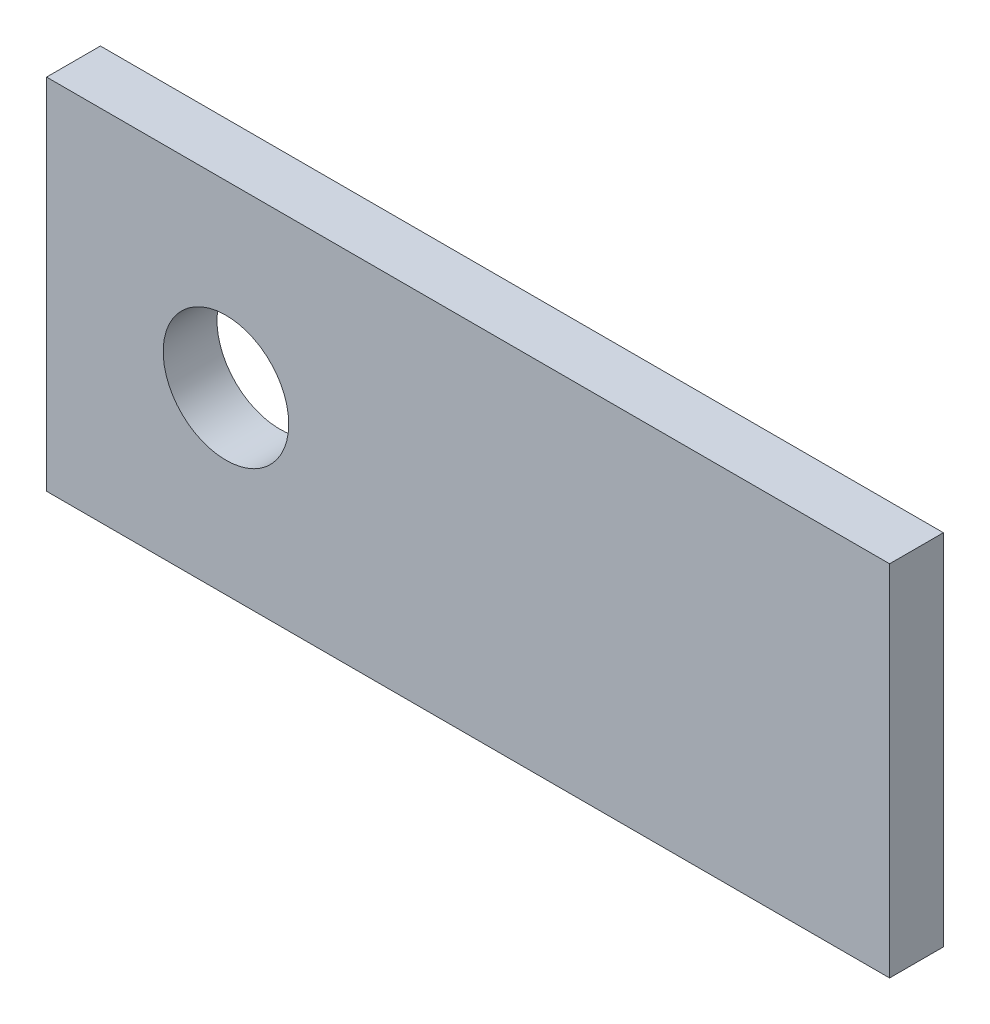
ISO-10303-21;
HEADER;
FILE_DESCRIPTION(('STEP AP214'),'2;1');
FILE_NAME('part.step','',(''),(''),'','','');
FILE_SCHEMA(('AUTOMOTIVE_DESIGN { 1 0 10303 214 1 1 1 1 }'));
ENDSEC;
DATA;
#1=APPLICATION_CONTEXT('core data for automotive mechanical design processes');
#2=APPLICATION_PROTOCOL_DEFINITION('international standard','automotive_design',2000,#1);
#3=PRODUCT_CONTEXT('',#1,'mechanical');
#4=PRODUCT('Part','Part','',(#3));
#5=PRODUCT_RELATED_PRODUCT_CATEGORY('part','',(#4));
#6=PRODUCT_DEFINITION_FORMATION('','',#4);
#7=PRODUCT_DEFINITION_CONTEXT('part definition',#1,'design');
#8=PRODUCT_DEFINITION('design','',#6,#7);
#9=PRODUCT_DEFINITION_SHAPE('','',#8);
#10=(LENGTH_UNIT() NAMED_UNIT(*) SI_UNIT(.MILLI.,.METRE.));
#11=(NAMED_UNIT(*) PLANE_ANGLE_UNIT() SI_UNIT($,.RADIAN.));
#12=(NAMED_UNIT(*) SI_UNIT($,.STERADIAN.) SOLID_ANGLE_UNIT());
#13=UNCERTAINTY_MEASURE_WITH_UNIT(LENGTH_MEASURE(1.E-05),#10,'distance_accuracy_value','');
#14=(GEOMETRIC_REPRESENTATION_CONTEXT(3) GLOBAL_UNCERTAINTY_ASSIGNED_CONTEXT((#13)) GLOBAL_UNIT_ASSIGNED_CONTEXT((#10,
#11,#12)) REPRESENTATION_CONTEXT('',''));
#15=CARTESIAN_POINT('',(0.,0.,0.));
#16=DIRECTION('',(0.,0.,1.));
#17=DIRECTION('',(1.,0.,0.));
#18=AXIS2_PLACEMENT_3D('',#15,#16,#17);
#19=CARTESIAN_POINT('',(0.,0.,0.3));
#20=DIRECTION('',(0.,0.,1.));
#21=DIRECTION('',(1.,0.,0.));
#22=AXIS2_PLACEMENT_3D('',#19,#20,#21);
#23=PLANE('',#22);
#24=DIRECTION('',(0.,-1.,0.));
#25=VECTOR('',#24,1.);
#26=CARTESIAN_POINT('',(0.,0.,0.3));
#27=LINE('',#26,#25);
#28=CARTESIAN_POINT('',(0.,0.,0.3));
#29=VERTEX_POINT('',#28);
#30=CARTESIAN_POINT('',(0.,-2.,0.3));
#31=VERTEX_POINT('',#30);
#32=EDGE_CURVE('E85',#29,#31,#27,.T.);
#33=ORIENTED_EDGE('',*,*,#32,.T.);
#34=DIRECTION('',(1.,0.,0.));
#35=VECTOR('',#34,1.);
#36=CARTESIAN_POINT('',(0.,-2.,0.3));
#37=LINE('',#36,#35);
#38=CARTESIAN_POINT('',(4.7,-2.,0.3));
#39=VERTEX_POINT('',#38);
#40=EDGE_CURVE('E80',#31,#39,#37,.T.);
#41=ORIENTED_EDGE('',*,*,#40,.T.);
#42=DIRECTION('',(0.,1.,0.));
#43=VECTOR('',#42,1.);
#44=CARTESIAN_POINT('',(4.7,0.,0.3));
#45=LINE('',#44,#43);
#46=CARTESIAN_POINT('',(4.7,0.,0.3));
#47=VERTEX_POINT('',#46);
#48=EDGE_CURVE('E83',#39,#47,#45,.T.);
#49=ORIENTED_EDGE('',*,*,#48,.T.);
#50=DIRECTION('',(-1.,0.,0.));
#51=VECTOR('',#50,1.);
#52=CARTESIAN_POINT('',(0.,0.,0.3));
#53=LINE('',#52,#51);
#54=EDGE_CURVE('E50',#47,#29,#53,.T.);
#55=ORIENTED_EDGE('',*,*,#54,.T.);
#56=EDGE_LOOP('',(#33,#41,#49,#55));
#57=FACE_BOUND('',#56,.T.);
#58=CARTESIAN_POINT('',(1.,-1.,0.3));
#59=DIRECTION('',(0.,0.,1.));
#60=DIRECTION('',(1.,0.,0.));
#61=AXIS2_PLACEMENT_3D('',#58,#59,#60);
#62=CIRCLE('',#61,0.35);
#63=CARTESIAN_POINT('',(1.35,-1.,0.3));
#64=VERTEX_POINT('',#63);
#65=EDGE_CURVE('E100',#64,#64,#62,.T.);
#66=ORIENTED_EDGE('',*,*,#65,.F.);
#67=EDGE_LOOP('',(#66));
#68=FACE_BOUND('',#67,.T.);
#69=ADVANCED_FACE('F33',(#57,#68),#23,.T.);
#70=CARTESIAN_POINT('',(0.,0.,0.));
#71=DIRECTION('',(0.,0.,1.));
#72=DIRECTION('',(1.,0.,0.));
#73=AXIS2_PLACEMENT_3D('',#70,#71,#72);
#74=PLANE('',#73);
#75=DIRECTION('',(0.,-1.,0.));
#76=VECTOR('',#75,1.);
#77=CARTESIAN_POINT('',(0.,0.,0.));
#78=LINE('',#77,#76);
#79=CARTESIAN_POINT('',(0.,0.,0.));
#80=VERTEX_POINT('',#79);
#81=CARTESIAN_POINT('',(0.,-2.,0.));
#82=VERTEX_POINT('',#81);
#83=EDGE_CURVE('E97',#80,#82,#78,.T.);
#84=ORIENTED_EDGE('',*,*,#83,.F.);
#85=DIRECTION('',(-1.,0.,0.));
#86=VECTOR('',#85,1.);
#87=CARTESIAN_POINT('',(0.,0.,0.));
#88=LINE('',#87,#86);
#89=CARTESIAN_POINT('',(4.7,0.,0.));
#90=VERTEX_POINT('',#89);
#91=EDGE_CURVE('E73',#90,#80,#88,.T.);
#92=ORIENTED_EDGE('',*,*,#91,.F.);
#93=DIRECTION('',(0.,1.,0.));
#94=VECTOR('',#93,1.);
#95=CARTESIAN_POINT('',(4.7,0.,0.));
#96=LINE('',#95,#94);
#97=CARTESIAN_POINT('',(4.7,-2.,0.));
#98=VERTEX_POINT('',#97);
#99=EDGE_CURVE('E67',#98,#90,#96,.T.);
#100=ORIENTED_EDGE('',*,*,#99,.F.);
#101=DIRECTION('',(1.,0.,0.));
#102=VECTOR('',#101,1.);
#103=CARTESIAN_POINT('',(0.,-2.,0.));
#104=LINE('',#103,#102);
#105=EDGE_CURVE('E89',#82,#98,#104,.T.);
#106=ORIENTED_EDGE('',*,*,#105,.F.);
#107=EDGE_LOOP('',(#84,#92,#100,#106));
#108=FACE_BOUND('',#107,.T.);
#109=CARTESIAN_POINT('',(1.,-1.,0.));
#110=DIRECTION('',(0.,0.,1.));
#111=DIRECTION('',(1.,0.,0.));
#112=AXIS2_PLACEMENT_3D('',#109,#110,#111);
#113=CIRCLE('',#112,0.35);
#114=CARTESIAN_POINT('',(1.35,-1.,0.));
#115=VERTEX_POINT('',#114);
#116=EDGE_CURVE('E112',#115,#115,#113,.T.);
#117=ORIENTED_EDGE('',*,*,#116,.T.);
#118=EDGE_LOOP('',(#117));
#119=FACE_BOUND('',#118,.T.);
#120=ADVANCED_FACE('F108',(#108,#119),#74,.F.);
#121=CARTESIAN_POINT('',(0.,0.,0.3));
#122=DIRECTION('',(1.,0.,0.));
#123=DIRECTION('',(0.,1.,0.));
#124=AXIS2_PLACEMENT_3D('',#121,#122,#123);
#125=PLANE('',#124);
#126=ORIENTED_EDGE('',*,*,#83,.T.);
#127=DIRECTION('',(0.,0.,-1.));
#128=VECTOR('',#127,1.);
#129=CARTESIAN_POINT('',(0.,-2.,0.3));
#130=LINE('',#129,#128);
#131=EDGE_CURVE('E11',#31,#82,#130,.T.);
#132=ORIENTED_EDGE('',*,*,#131,.F.);
#133=ORIENTED_EDGE('',*,*,#32,.F.);
#134=DIRECTION('',(0.,0.,-1.));
#135=VECTOR('',#134,1.);
#136=CARTESIAN_POINT('',(0.,0.,0.3));
#137=LINE('',#136,#135);
#138=EDGE_CURVE('E93',#29,#80,#137,.T.);
#139=ORIENTED_EDGE('',*,*,#138,.T.);
#140=EDGE_LOOP('',(#126,#132,#133,#139));
#141=FACE_BOUND('',#140,.T.);
#142=ADVANCED_FACE('F35',(#141),#125,.F.);
#143=CARTESIAN_POINT('',(0.,-2.,0.3));
#144=DIRECTION('',(0.,1.,0.));
#145=DIRECTION('',(0.,0.,1.));
#146=AXIS2_PLACEMENT_3D('',#143,#144,#145);
#147=PLANE('',#146);
#148=ORIENTED_EDGE('',*,*,#105,.T.);
#149=DIRECTION('',(0.,0.,-1.));
#150=VECTOR('',#149,1.);
#151=CARTESIAN_POINT('',(4.7,-2.,0.3));
#152=LINE('',#151,#150);
#153=EDGE_CURVE('E42',#39,#98,#152,.T.);
#154=ORIENTED_EDGE('',*,*,#153,.F.);
#155=ORIENTED_EDGE('',*,*,#40,.F.);
#156=ORIENTED_EDGE('',*,*,#131,.T.);
#157=EDGE_LOOP('',(#148,#154,#155,#156));
#158=FACE_BOUND('',#157,.T.);
#159=ADVANCED_FACE('F88',(#158),#147,.F.);
#160=CARTESIAN_POINT('',(4.7,0.,0.3));
#161=DIRECTION('',(-1.,0.,0.));
#162=DIRECTION('',(0.,0.,1.));
#163=AXIS2_PLACEMENT_3D('',#160,#161,#162);
#164=PLANE('',#163);
#165=ORIENTED_EDGE('',*,*,#99,.T.);
#166=DIRECTION('',(0.,0.,-1.));
#167=VECTOR('',#166,1.);
#168=CARTESIAN_POINT('',(4.7,0.,0.3));
#169=LINE('',#168,#167);
#170=EDGE_CURVE('E90',#47,#90,#169,.T.);
#171=ORIENTED_EDGE('',*,*,#170,.F.);
#172=ORIENTED_EDGE('',*,*,#48,.F.);
#173=ORIENTED_EDGE('',*,*,#153,.T.);
#174=EDGE_LOOP('',(#165,#171,#172,#173));
#175=FACE_BOUND('',#174,.T.);
#176=ADVANCED_FACE('F91',(#175),#164,.F.);
#177=CARTESIAN_POINT('',(0.,0.,0.3));
#178=DIRECTION('',(0.,-1.,0.));
#179=DIRECTION('',(0.,0.,-1.));
#180=AXIS2_PLACEMENT_3D('',#177,#178,#179);
#181=PLANE('',#180);
#182=ORIENTED_EDGE('',*,*,#91,.T.);
#183=ORIENTED_EDGE('',*,*,#138,.F.);
#184=ORIENTED_EDGE('',*,*,#54,.F.);
#185=ORIENTED_EDGE('',*,*,#170,.T.);
#186=EDGE_LOOP('',(#182,#183,#184,#185));
#187=FACE_BOUND('',#186,.T.);
#188=ADVANCED_FACE('F105',(#187),#181,.F.);
#189=CARTESIAN_POINT('',(1.,-1.,0.3));
#190=DIRECTION('',(0.,0.,-1.));
#191=DIRECTION('',(-1.,0.,0.));
#192=AXIS2_PLACEMENT_3D('',#189,#190,#191);
#193=CYLINDRICAL_SURFACE('',#192,0.35);
#194=ORIENTED_EDGE('',*,*,#65,.T.);
#195=EDGE_LOOP('',(#194));
#196=FACE_BOUND('',#195,.T.);
#197=ORIENTED_EDGE('',*,*,#116,.F.);
#198=EDGE_LOOP('',(#197));
#199=FACE_BOUND('',#198,.T.);
#200=ADVANCED_FACE('F118',(#196,#199),#193,.F.);
#201=CLOSED_SHELL('',(#69,#120,#142,#159,#176,#188,#200));
#202=MANIFOLD_SOLID_BREP('B2',#201);
#203=ADVANCED_BREP_SHAPE_REPRESENTATION('',(#18,#202),#14);
#204=SHAPE_DEFINITION_REPRESENTATION(#9,#203);
ENDSEC;
END-ISO-10303-21;
